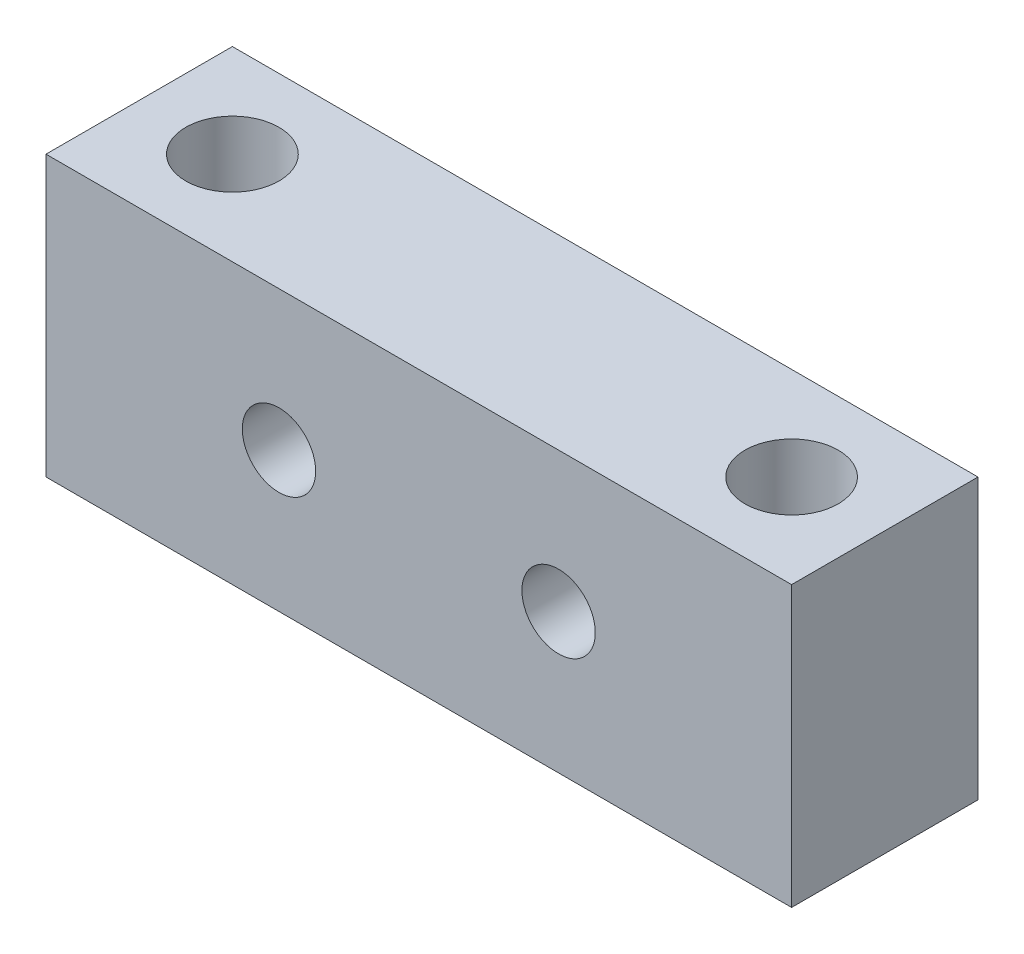
ISO-10303-21;
HEADER;
FILE_DESCRIPTION(('STEP AP214'),'2;1');
FILE_NAME('part.step','',(''),(''),'','','');
FILE_SCHEMA(('AUTOMOTIVE_DESIGN { 1 0 10303 214 1 1 1 1 }'));
ENDSEC;
DATA;
#1=APPLICATION_CONTEXT('core data for automotive mechanical design processes');
#2=APPLICATION_PROTOCOL_DEFINITION('international standard','automotive_design',2000,#1);
#3=PRODUCT_CONTEXT('',#1,'mechanical');
#4=PRODUCT('Part','Part','',(#3));
#5=PRODUCT_RELATED_PRODUCT_CATEGORY('part','',(#4));
#6=PRODUCT_DEFINITION_FORMATION('','',#4);
#7=PRODUCT_DEFINITION_CONTEXT('part definition',#1,'design');
#8=PRODUCT_DEFINITION('design','',#6,#7);
#9=PRODUCT_DEFINITION_SHAPE('','',#8);
#10=(LENGTH_UNIT() NAMED_UNIT(*) SI_UNIT(.MILLI.,.METRE.));
#11=(NAMED_UNIT(*) PLANE_ANGLE_UNIT() SI_UNIT($,.RADIAN.));
#12=(NAMED_UNIT(*) SI_UNIT($,.STERADIAN.) SOLID_ANGLE_UNIT());
#13=UNCERTAINTY_MEASURE_WITH_UNIT(LENGTH_MEASURE(1.E-05),#10,'distance_accuracy_value','');
#14=(GEOMETRIC_REPRESENTATION_CONTEXT(3) GLOBAL_UNCERTAINTY_ASSIGNED_CONTEXT((#13)) GLOBAL_UNIT_ASSIGNED_CONTEXT((#10,
#11,#12)) REPRESENTATION_CONTEXT('',''));
#15=CARTESIAN_POINT('',(0.,0.,0.));
#16=DIRECTION('',(0.,0.,1.));
#17=DIRECTION('',(1.,0.,0.));
#18=AXIS2_PLACEMENT_3D('',#15,#16,#17);
#19=CARTESIAN_POINT('',(25.4,9.525,12.7));
#20=DIRECTION('',(-1.,0.,0.));
#21=DIRECTION('',(0.,-1.,0.));
#22=AXIS2_PLACEMENT_3D('',#19,#20,#21);
#23=PLANE('',#22);
#24=DIRECTION('',(0.,1.,0.));
#25=VECTOR('',#24,1.);
#26=CARTESIAN_POINT('',(25.4,9.525,0.));
#27=LINE('',#26,#25);
#28=CARTESIAN_POINT('',(25.4,-9.525,0.));
#29=VERTEX_POINT('',#28);
#30=CARTESIAN_POINT('',(25.4,9.525,0.));
#31=VERTEX_POINT('',#30);
#32=EDGE_CURVE('E102',#29,#31,#27,.T.);
#33=ORIENTED_EDGE('',*,*,#32,.T.);
#34=DIRECTION('',(0.,0.,-1.));
#35=VECTOR('',#34,1.);
#36=CARTESIAN_POINT('',(25.4,9.525,12.7));
#37=LINE('',#36,#35);
#38=CARTESIAN_POINT('',(25.4,9.525,12.7));
#39=VERTEX_POINT('',#38);
#40=EDGE_CURVE('E11',#39,#31,#37,.T.);
#41=ORIENTED_EDGE('',*,*,#40,.F.);
#42=DIRECTION('',(0.,1.,0.));
#43=VECTOR('',#42,1.);
#44=CARTESIAN_POINT('',(25.4,9.525,12.7));
#45=LINE('',#44,#43);
#46=CARTESIAN_POINT('',(25.4,-9.525,12.7));
#47=VERTEX_POINT('',#46);
#48=EDGE_CURVE('E90',#47,#39,#45,.T.);
#49=ORIENTED_EDGE('',*,*,#48,.F.);
#50=DIRECTION('',(0.,0.,-1.));
#51=VECTOR('',#50,1.);
#52=CARTESIAN_POINT('',(25.4,-9.525,12.7));
#53=LINE('',#52,#51);
#54=EDGE_CURVE('E98',#47,#29,#53,.T.);
#55=ORIENTED_EDGE('',*,*,#54,.T.);
#56=EDGE_LOOP('',(#33,#41,#49,#55));
#57=FACE_BOUND('',#56,.T.);
#58=ADVANCED_FACE('F39',(#57),#23,.F.);
#59=CARTESIAN_POINT('',(-25.4,9.525,12.7));
#60=DIRECTION('',(0.,-1.,0.));
#61=DIRECTION('',(0.,0.,-1.));
#62=AXIS2_PLACEMENT_3D('',#59,#60,#61);
#63=PLANE('',#62);
#64=CARTESIAN_POINT('',(-19.05,9.525,6.35));
#65=DIRECTION('',(0.,1.,0.));
#66=DIRECTION('',(0.,0.,1.));
#67=AXIS2_PLACEMENT_3D('',#64,#65,#66);
#68=CIRCLE('',#67,3.175);
#69=CARTESIAN_POINT('',(-19.05,9.525,9.525));
#70=VERTEX_POINT('',#69);
#71=EDGE_CURVE('E134',#70,#70,#68,.T.);
#72=ORIENTED_EDGE('',*,*,#71,.F.);
#73=EDGE_LOOP('',(#72));
#74=FACE_BOUND('',#73,.T.);
#75=CARTESIAN_POINT('',(19.05,9.525,6.35));
#76=DIRECTION('',(0.,1.,0.));
#77=DIRECTION('',(0.,0.,-1.));
#78=AXIS2_PLACEMENT_3D('',#75,#76,#77);
#79=CIRCLE('',#78,3.175);
#80=CARTESIAN_POINT('',(19.05,9.525,9.525));
#81=VERTEX_POINT('',#80);
#82=EDGE_CURVE('E131',#81,#81,#79,.T.);
#83=ORIENTED_EDGE('',*,*,#82,.F.);
#84=EDGE_LOOP('',(#83));
#85=FACE_BOUND('',#84,.T.);
#86=DIRECTION('',(-1.,0.,0.));
#87=VECTOR('',#86,1.);
#88=CARTESIAN_POINT('',(-25.4,9.525,0.));
#89=LINE('',#88,#87);
#90=CARTESIAN_POINT('',(-25.4,9.525,0.));
#91=VERTEX_POINT('',#90);
#92=EDGE_CURVE('E94',#31,#91,#89,.T.);
#93=ORIENTED_EDGE('',*,*,#92,.T.);
#94=DIRECTION('',(0.,0.,-1.));
#95=VECTOR('',#94,1.);
#96=CARTESIAN_POINT('',(-25.4,9.525,12.7));
#97=LINE('',#96,#95);
#98=CARTESIAN_POINT('',(-25.4,9.525,12.7));
#99=VERTEX_POINT('',#98);
#100=EDGE_CURVE('E47',#99,#91,#97,.T.);
#101=ORIENTED_EDGE('',*,*,#100,.F.);
#102=DIRECTION('',(-1.,0.,0.));
#103=VECTOR('',#102,1.);
#104=CARTESIAN_POINT('',(-25.4,9.525,12.7));
#105=LINE('',#104,#103);
#106=EDGE_CURVE('E85',#39,#99,#105,.T.);
#107=ORIENTED_EDGE('',*,*,#106,.F.);
#108=ORIENTED_EDGE('',*,*,#40,.T.);
#109=EDGE_LOOP('',(#93,#101,#107,#108));
#110=FACE_BOUND('',#109,.T.);
#111=ADVANCED_FACE('F93',(#74,#85,#110),#63,.F.);
#112=CARTESIAN_POINT('',(-25.4,9.525,12.7));
#113=DIRECTION('',(1.,0.,0.));
#114=DIRECTION('',(0.,1.,0.));
#115=AXIS2_PLACEMENT_3D('',#112,#113,#114);
#116=PLANE('',#115);
#117=DIRECTION('',(0.,-1.,0.));
#118=VECTOR('',#117,1.);
#119=CARTESIAN_POINT('',(-25.4,9.525,0.));
#120=LINE('',#119,#118);
#121=CARTESIAN_POINT('',(-25.4,-9.525,0.));
#122=VERTEX_POINT('',#121);
#123=EDGE_CURVE('E72',#91,#122,#120,.T.);
#124=ORIENTED_EDGE('',*,*,#123,.T.);
#125=DIRECTION('',(0.,0.,-1.));
#126=VECTOR('',#125,1.);
#127=CARTESIAN_POINT('',(-25.4,-9.525,12.7));
#128=LINE('',#127,#126);
#129=CARTESIAN_POINT('',(-25.4,-9.525,12.7));
#130=VERTEX_POINT('',#129);
#131=EDGE_CURVE('E95',#130,#122,#128,.T.);
#132=ORIENTED_EDGE('',*,*,#131,.F.);
#133=DIRECTION('',(0.,-1.,0.));
#134=VECTOR('',#133,1.);
#135=CARTESIAN_POINT('',(-25.4,9.525,12.7));
#136=LINE('',#135,#134);
#137=EDGE_CURVE('E88',#99,#130,#136,.T.);
#138=ORIENTED_EDGE('',*,*,#137,.F.);
#139=ORIENTED_EDGE('',*,*,#100,.T.);
#140=EDGE_LOOP('',(#124,#132,#138,#139));
#141=FACE_BOUND('',#140,.T.);
#142=ADVANCED_FACE('F96',(#141),#116,.F.);
#143=CARTESIAN_POINT('',(-25.4,-9.525,12.7));
#144=DIRECTION('',(0.,1.,0.));
#145=DIRECTION('',(0.,0.,1.));
#146=AXIS2_PLACEMENT_3D('',#143,#144,#145);
#147=PLANE('',#146);
#148=CARTESIAN_POINT('',(-19.05,-9.525,6.35));
#149=DIRECTION('',(0.,1.,0.));
#150=DIRECTION('',(0.,0.,1.));
#151=AXIS2_PLACEMENT_3D('',#148,#149,#150);
#152=CIRCLE('',#151,3.175);
#153=CARTESIAN_POINT('',(-19.05,-9.525,9.525));
#154=VERTEX_POINT('',#153);
#155=EDGE_CURVE('E120',#154,#154,#152,.T.);
#156=ORIENTED_EDGE('',*,*,#155,.T.);
#157=EDGE_LOOP('',(#156));
#158=FACE_BOUND('',#157,.T.);
#159=CARTESIAN_POINT('',(19.05,-9.525,6.35));
#160=DIRECTION('',(0.,1.,0.));
#161=DIRECTION('',(0.,0.,-1.));
#162=AXIS2_PLACEMENT_3D('',#159,#160,#161);
#163=CIRCLE('',#162,3.175);
#164=CARTESIAN_POINT('',(19.05,-9.525,9.525));
#165=VERTEX_POINT('',#164);
#166=EDGE_CURVE('E128',#165,#165,#163,.T.);
#167=ORIENTED_EDGE('',*,*,#166,.T.);
#168=EDGE_LOOP('',(#167));
#169=FACE_BOUND('',#168,.T.);
#170=DIRECTION('',(1.,0.,0.));
#171=VECTOR('',#170,1.);
#172=CARTESIAN_POINT('',(-25.4,-9.525,0.));
#173=LINE('',#172,#171);
#174=EDGE_CURVE('E78',#122,#29,#173,.T.);
#175=ORIENTED_EDGE('',*,*,#174,.T.);
#176=ORIENTED_EDGE('',*,*,#54,.F.);
#177=DIRECTION('',(1.,0.,0.));
#178=VECTOR('',#177,1.);
#179=CARTESIAN_POINT('',(-25.4,-9.525,12.7));
#180=LINE('',#179,#178);
#181=EDGE_CURVE('E55',#130,#47,#180,.T.);
#182=ORIENTED_EDGE('',*,*,#181,.F.);
#183=ORIENTED_EDGE('',*,*,#131,.T.);
#184=EDGE_LOOP('',(#175,#176,#182,#183));
#185=FACE_BOUND('',#184,.T.);
#186=ADVANCED_FACE('F110',(#158,#169,#185),#147,.F.);
#187=CARTESIAN_POINT('',(0.,0.,12.7));
#188=DIRECTION('',(0.,0.,1.));
#189=DIRECTION('',(1.,0.,0.));
#190=AXIS2_PLACEMENT_3D('',#187,#188,#189);
#191=PLANE('',#190);
#192=CARTESIAN_POINT('',(-9.525,0.,12.7));
#193=DIRECTION('',(0.,0.,1.));
#194=DIRECTION('',(1.,0.,0.));
#195=AXIS2_PLACEMENT_3D('',#192,#193,#194);
#196=CIRCLE('',#195,2.5);
#197=CARTESIAN_POINT('',(-7.025,0.,12.7));
#198=VERTEX_POINT('',#197);
#199=EDGE_CURVE('E123',#198,#198,#196,.T.);
#200=ORIENTED_EDGE('',*,*,#199,.F.);
#201=EDGE_LOOP('',(#200));
#202=FACE_BOUND('',#201,.T.);
#203=CARTESIAN_POINT('',(9.525,0.,12.7));
#204=DIRECTION('',(0.,0.,1.));
#205=DIRECTION('',(-1.,0.,0.));
#206=AXIS2_PLACEMENT_3D('',#203,#204,#205);
#207=CIRCLE('',#206,2.5);
#208=CARTESIAN_POINT('',(7.025,0.,12.7));
#209=VERTEX_POINT('',#208);
#210=EDGE_CURVE('E119',#209,#209,#207,.T.);
#211=ORIENTED_EDGE('',*,*,#210,.F.);
#212=EDGE_LOOP('',(#211));
#213=FACE_BOUND('',#212,.T.);
#214=ORIENTED_EDGE('',*,*,#48,.T.);
#215=ORIENTED_EDGE('',*,*,#106,.T.);
#216=ORIENTED_EDGE('',*,*,#137,.T.);
#217=ORIENTED_EDGE('',*,*,#181,.T.);
#218=EDGE_LOOP('',(#214,#215,#216,#217));
#219=FACE_BOUND('',#218,.T.);
#220=ADVANCED_FACE('F86',(#202,#213,#219),#191,.T.);
#221=CARTESIAN_POINT('',(0.,0.,0.));
#222=DIRECTION('',(0.,0.,1.));
#223=DIRECTION('',(1.,0.,0.));
#224=AXIS2_PLACEMENT_3D('',#221,#222,#223);
#225=PLANE('',#224);
#226=CARTESIAN_POINT('',(-9.525,0.,0.));
#227=DIRECTION('',(0.,0.,1.));
#228=DIRECTION('',(1.,0.,0.));
#229=AXIS2_PLACEMENT_3D('',#226,#227,#228);
#230=CIRCLE('',#229,2.5);
#231=CARTESIAN_POINT('',(-7.025,0.,0.));
#232=VERTEX_POINT('',#231);
#233=EDGE_CURVE('E105',#232,#232,#230,.T.);
#234=ORIENTED_EDGE('',*,*,#233,.T.);
#235=EDGE_LOOP('',(#234));
#236=FACE_BOUND('',#235,.T.);
#237=CARTESIAN_POINT('',(9.525,0.,0.));
#238=DIRECTION('',(0.,0.,1.));
#239=DIRECTION('',(-1.,0.,0.));
#240=AXIS2_PLACEMENT_3D('',#237,#238,#239);
#241=CIRCLE('',#240,2.5);
#242=CARTESIAN_POINT('',(7.025,0.,0.));
#243=VERTEX_POINT('',#242);
#244=EDGE_CURVE('E116',#243,#243,#241,.T.);
#245=ORIENTED_EDGE('',*,*,#244,.T.);
#246=EDGE_LOOP('',(#245));
#247=FACE_BOUND('',#246,.T.);
#248=ORIENTED_EDGE('',*,*,#32,.F.);
#249=ORIENTED_EDGE('',*,*,#174,.F.);
#250=ORIENTED_EDGE('',*,*,#123,.F.);
#251=ORIENTED_EDGE('',*,*,#92,.F.);
#252=EDGE_LOOP('',(#248,#249,#250,#251));
#253=FACE_BOUND('',#252,.T.);
#254=ADVANCED_FACE('F113',(#236,#247,#253),#225,.F.);
#255=CARTESIAN_POINT('',(9.525,0.,0.));
#256=DIRECTION('',(0.,0.,1.));
#257=DIRECTION('',(1.,0.,0.));
#258=AXIS2_PLACEMENT_3D('',#255,#256,#257);
#259=CYLINDRICAL_SURFACE('',#258,2.5);
#260=ORIENTED_EDGE('',*,*,#244,.F.);
#261=EDGE_LOOP('',(#260));
#262=FACE_BOUND('',#261,.T.);
#263=ORIENTED_EDGE('',*,*,#210,.T.);
#264=EDGE_LOOP('',(#263));
#265=FACE_BOUND('',#264,.T.);
#266=ADVANCED_FACE('F161',(#262,#265),#259,.F.);
#267=CARTESIAN_POINT('',(-9.525,0.,0.));
#268=DIRECTION('',(0.,0.,1.));
#269=DIRECTION('',(1.,0.,0.));
#270=AXIS2_PLACEMENT_3D('',#267,#268,#269);
#271=CYLINDRICAL_SURFACE('',#270,2.5);
#272=ORIENTED_EDGE('',*,*,#233,.F.);
#273=EDGE_LOOP('',(#272));
#274=FACE_BOUND('',#273,.T.);
#275=ORIENTED_EDGE('',*,*,#199,.T.);
#276=EDGE_LOOP('',(#275));
#277=FACE_BOUND('',#276,.T.);
#278=ADVANCED_FACE('F154',(#274,#277),#271,.F.);
#279=CARTESIAN_POINT('',(19.05,-9.525,6.35));
#280=DIRECTION('',(0.,1.,0.));
#281=DIRECTION('',(0.,0.,1.));
#282=AXIS2_PLACEMENT_3D('',#279,#280,#281);
#283=CYLINDRICAL_SURFACE('',#282,3.175);
#284=CARTESIAN_POINT('',(19.05,-9.525,9.525));
#285=CARTESIAN_POINT('',(19.05,-9.3265625,9.525));
#286=CARTESIAN_POINT('',(19.05,-9.128125,9.525));
#287=CARTESIAN_POINT('',(19.05,-8.73125,9.525));
#288=CARTESIAN_POINT('',(19.05,-8.5328125,9.525));
#289=CARTESIAN_POINT('',(19.05,-8.1359375,9.525));
#290=CARTESIAN_POINT('',(19.05,-7.9375,9.525));
#291=CARTESIAN_POINT('',(19.05,-7.540625,9.525));
#292=CARTESIAN_POINT('',(19.05,-7.3421875,9.525));
#293=CARTESIAN_POINT('',(19.05,-6.9453125,9.525));
#294=CARTESIAN_POINT('',(19.05,-6.746875,9.525));
#295=CARTESIAN_POINT('',(19.05,-6.35,9.525));
#296=CARTESIAN_POINT('',(19.05,-6.1515625,9.525));
#297=CARTESIAN_POINT('',(19.05,-5.7546875,9.525));
#298=CARTESIAN_POINT('',(19.05,-5.55625,9.525));
#299=CARTESIAN_POINT('',(19.05,-5.159375,9.525));
#300=CARTESIAN_POINT('',(19.05,-4.9609375,9.525));
#301=CARTESIAN_POINT('',(19.05,-4.5640625,9.525));
#302=CARTESIAN_POINT('',(19.05,-4.365625,9.525));
#303=CARTESIAN_POINT('',(19.05,-3.96875,9.525));
#304=CARTESIAN_POINT('',(19.05,-3.7703125,9.525));
#305=CARTESIAN_POINT('',(19.05,-3.3734375,9.525));
#306=CARTESIAN_POINT('',(19.05,-3.175,9.525));
#307=CARTESIAN_POINT('',(19.05,-2.778125,9.525));
#308=CARTESIAN_POINT('',(19.05,-2.5796875,9.525));
#309=CARTESIAN_POINT('',(19.05,-2.1828125,9.525));
#310=CARTESIAN_POINT('',(19.05,-1.984375,9.525));
#311=CARTESIAN_POINT('',(19.05,-1.5875,9.525));
#312=CARTESIAN_POINT('',(19.05,-1.3890625,9.525));
#313=CARTESIAN_POINT('',(19.05,-0.992187500000002,9.525));
#314=CARTESIAN_POINT('',(19.05,-0.793750000000002,9.525));
#315=CARTESIAN_POINT('',(19.05,-0.396875000000002,9.525));
#316=CARTESIAN_POINT('',(19.05,-0.198437500000002,9.525));
#317=CARTESIAN_POINT('',(19.05,0.198437499999998,9.525));
#318=CARTESIAN_POINT('',(19.05,0.396874999999998,9.525));
#319=CARTESIAN_POINT('',(19.05,0.793749999999999,9.525));
#320=CARTESIAN_POINT('',(19.05,0.992187499999999,9.525));
#321=CARTESIAN_POINT('',(19.05,1.3890625,9.525));
#322=CARTESIAN_POINT('',(19.05,1.5875,9.525));
#323=CARTESIAN_POINT('',(19.05,1.984375,9.525));
#324=CARTESIAN_POINT('',(19.05,2.1828125,9.525));
#325=CARTESIAN_POINT('',(19.05,2.5796875,9.525));
#326=CARTESIAN_POINT('',(19.05,2.778125,9.525));
#327=CARTESIAN_POINT('',(19.05,3.175,9.525));
#328=CARTESIAN_POINT('',(19.05,3.3734375,9.525));
#329=CARTESIAN_POINT('',(19.05,3.7703125,9.525));
#330=CARTESIAN_POINT('',(19.05,3.96875,9.525));
#331=CARTESIAN_POINT('',(19.05,4.365625,9.525));
#332=CARTESIAN_POINT('',(19.05,4.5640625,9.525));
#333=CARTESIAN_POINT('',(19.05,4.9609375,9.525));
#334=CARTESIAN_POINT('',(19.05,5.159375,9.525));
#335=CARTESIAN_POINT('',(19.05,5.55625,9.525));
#336=CARTESIAN_POINT('',(19.05,5.7546875,9.525));
#337=CARTESIAN_POINT('',(19.05,6.1515625,9.525));
#338=CARTESIAN_POINT('',(19.05,6.35,9.525));
#339=CARTESIAN_POINT('',(19.05,6.746875,9.525));
#340=CARTESIAN_POINT('',(19.05,6.9453125,9.525));
#341=CARTESIAN_POINT('',(19.05,7.3421875,9.525));
#342=CARTESIAN_POINT('',(19.05,7.540625,9.525));
#343=CARTESIAN_POINT('',(19.05,7.9375,9.525));
#344=CARTESIAN_POINT('',(19.05,8.1359375,9.525));
#345=CARTESIAN_POINT('',(19.05,8.5328125,9.525));
#346=CARTESIAN_POINT('',(19.05,8.73125,9.525));
#347=CARTESIAN_POINT('',(19.05,9.128125,9.525));
#348=CARTESIAN_POINT('',(19.05,9.3265625,9.525));
#349=CARTESIAN_POINT('',(19.05,9.525,9.525));
#350=B_SPLINE_CURVE_WITH_KNOTS('',3,(#284,#285,#286,#287,#288,#289,#290,#291,#292,#293,#294,
#295,#296,#297,#298,#299,#300,#301,#302,#303,#304,#305,#306,#307,#308,#309,#310,#311,#312,#313,
#314,#315,#316,#317,#318,#319,#320,#321,#322,#323,#324,#325,#326,#327,#328,#329,#330,#331,#332,
#333,#334,#335,#336,#337,#338,#339,#340,#341,#342,#343,#344,#345,#346,#347,#348,#349),
.UNSPECIFIED.,.F.,.F.,(4,2,2,2,2,2,2,2,2,2,2,2,2,2,2,2,2,2,2,2,2,2,2,2,2,2,2,2,2,2,2,2,4),(0.,
0.5953125,1.190625,1.7859375,2.38125,2.9765625,3.571875,4.1671875,4.7625,5.3578125,5.953125,
6.5484375,7.14375,7.7390625,8.334375,8.9296875,9.525,10.1203125,10.715625,11.3109375,11.90625,
12.5015625,13.096875,13.6921875,14.2875,14.8828125,15.478125,16.0734375,16.66875,17.2640625,
17.859375,18.4546875,19.05),.UNSPECIFIED.);
#351=EDGE_CURVE('BSEAM145',#165,#81,#350,.T.);
#352=ORIENTED_EDGE('',*,*,#166,.F.);
#353=ORIENTED_EDGE('',*,*,#82,.T.);
#354=ORIENTED_EDGE('',*,*,#351,.T.);
#355=ORIENTED_EDGE('',*,*,#351,.F.);
#356=EDGE_LOOP('',(#352,#354,#353,#355));
#357=FACE_BOUND('',#356,.T.);
#358=ADVANCED_FACE('F145',(#357),#283,.F.);
#359=CARTESIAN_POINT('',(-19.05,-9.525,6.35));
#360=DIRECTION('',(0.,1.,0.));
#361=DIRECTION('',(0.,0.,1.));
#362=AXIS2_PLACEMENT_3D('',#359,#360,#361);
#363=CYLINDRICAL_SURFACE('',#362,3.175);
#364=CARTESIAN_POINT('',(-19.05,-9.525,9.525));
#365=CARTESIAN_POINT('',(-19.05,-9.3265625,9.525));
#366=CARTESIAN_POINT('',(-19.05,-9.128125,9.525));
#367=CARTESIAN_POINT('',(-19.05,-8.73125,9.525));
#368=CARTESIAN_POINT('',(-19.05,-8.5328125,9.525));
#369=CARTESIAN_POINT('',(-19.05,-8.1359375,9.525));
#370=CARTESIAN_POINT('',(-19.05,-7.9375,9.525));
#371=CARTESIAN_POINT('',(-19.05,-7.540625,9.525));
#372=CARTESIAN_POINT('',(-19.05,-7.3421875,9.525));
#373=CARTESIAN_POINT('',(-19.05,-6.9453125,9.525));
#374=CARTESIAN_POINT('',(-19.05,-6.746875,9.525));
#375=CARTESIAN_POINT('',(-19.05,-6.35,9.525));
#376=CARTESIAN_POINT('',(-19.05,-6.1515625,9.525));
#377=CARTESIAN_POINT('',(-19.05,-5.7546875,9.525));
#378=CARTESIAN_POINT('',(-19.05,-5.55625,9.525));
#379=CARTESIAN_POINT('',(-19.05,-5.159375,9.525));
#380=CARTESIAN_POINT('',(-19.05,-4.9609375,9.525));
#381=CARTESIAN_POINT('',(-19.05,-4.5640625,9.525));
#382=CARTESIAN_POINT('',(-19.05,-4.365625,9.525));
#383=CARTESIAN_POINT('',(-19.05,-3.96875,9.525));
#384=CARTESIAN_POINT('',(-19.05,-3.7703125,9.525));
#385=CARTESIAN_POINT('',(-19.05,-3.3734375,9.525));
#386=CARTESIAN_POINT('',(-19.05,-3.175,9.525));
#387=CARTESIAN_POINT('',(-19.05,-2.778125,9.525));
#388=CARTESIAN_POINT('',(-19.05,-2.5796875,9.525));
#389=CARTESIAN_POINT('',(-19.05,-2.1828125,9.525));
#390=CARTESIAN_POINT('',(-19.05,-1.984375,9.525));
#391=CARTESIAN_POINT('',(-19.05,-1.5875,9.525));
#392=CARTESIAN_POINT('',(-19.05,-1.3890625,9.525));
#393=CARTESIAN_POINT('',(-19.05,-0.992187500000002,9.525));
#394=CARTESIAN_POINT('',(-19.05,-0.793750000000002,9.525));
#395=CARTESIAN_POINT('',(-19.05,-0.396875000000002,9.525));
#396=CARTESIAN_POINT('',(-19.05,-0.198437500000002,9.525));
#397=CARTESIAN_POINT('',(-19.05,0.198437499999998,9.525));
#398=CARTESIAN_POINT('',(-19.05,0.396874999999998,9.525));
#399=CARTESIAN_POINT('',(-19.05,0.793749999999999,9.525));
#400=CARTESIAN_POINT('',(-19.05,0.992187499999999,9.525));
#401=CARTESIAN_POINT('',(-19.05,1.3890625,9.525));
#402=CARTESIAN_POINT('',(-19.05,1.5875,9.525));
#403=CARTESIAN_POINT('',(-19.05,1.984375,9.525));
#404=CARTESIAN_POINT('',(-19.05,2.1828125,9.525));
#405=CARTESIAN_POINT('',(-19.05,2.5796875,9.525));
#406=CARTESIAN_POINT('',(-19.05,2.778125,9.525));
#407=CARTESIAN_POINT('',(-19.05,3.175,9.525));
#408=CARTESIAN_POINT('',(-19.05,3.3734375,9.525));
#409=CARTESIAN_POINT('',(-19.05,3.7703125,9.525));
#410=CARTESIAN_POINT('',(-19.05,3.96875,9.525));
#411=CARTESIAN_POINT('',(-19.05,4.365625,9.525));
#412=CARTESIAN_POINT('',(-19.05,4.5640625,9.525));
#413=CARTESIAN_POINT('',(-19.05,4.9609375,9.525));
#414=CARTESIAN_POINT('',(-19.05,5.159375,9.525));
#415=CARTESIAN_POINT('',(-19.05,5.55625,9.525));
#416=CARTESIAN_POINT('',(-19.05,5.7546875,9.525));
#417=CARTESIAN_POINT('',(-19.05,6.1515625,9.525));
#418=CARTESIAN_POINT('',(-19.05,6.35,9.525));
#419=CARTESIAN_POINT('',(-19.05,6.746875,9.525));
#420=CARTESIAN_POINT('',(-19.05,6.9453125,9.525));
#421=CARTESIAN_POINT('',(-19.05,7.3421875,9.525));
#422=CARTESIAN_POINT('',(-19.05,7.540625,9.525));
#423=CARTESIAN_POINT('',(-19.05,7.9375,9.525));
#424=CARTESIAN_POINT('',(-19.05,8.1359375,9.525));
#425=CARTESIAN_POINT('',(-19.05,8.5328125,9.525));
#426=CARTESIAN_POINT('',(-19.05,8.73125,9.525));
#427=CARTESIAN_POINT('',(-19.05,9.128125,9.525));
#428=CARTESIAN_POINT('',(-19.05,9.3265625,9.525));
#429=CARTESIAN_POINT('',(-19.05,9.525,9.525));
#430=B_SPLINE_CURVE_WITH_KNOTS('',3,(#364,#365,#366,#367,#368,#369,#370,#371,#372,#373,#374,
#375,#376,#377,#378,#379,#380,#381,#382,#383,#384,#385,#386,#387,#388,#389,#390,#391,#392,#393,
#394,#395,#396,#397,#398,#399,#400,#401,#402,#403,#404,#405,#406,#407,#408,#409,#410,#411,#412,
#413,#414,#415,#416,#417,#418,#419,#420,#421,#422,#423,#424,#425,#426,#427,#428,#429),
.UNSPECIFIED.,.F.,.F.,(4,2,2,2,2,2,2,2,2,2,2,2,2,2,2,2,2,2,2,2,2,2,2,2,2,2,2,2,2,2,2,2,4),(0.,
0.5953125,1.190625,1.7859375,2.38125,2.9765625,3.571875,4.1671875,4.7625,5.3578125,5.953125,
6.5484375,7.14375,7.7390625,8.334375,8.9296875,9.525,10.1203125,10.715625,11.3109375,11.90625,
12.5015625,13.096875,13.6921875,14.2875,14.8828125,15.478125,16.0734375,16.66875,17.2640625,
17.859375,18.4546875,19.05),.UNSPECIFIED.);
#431=EDGE_CURVE('BSEAM142',#154,#70,#430,.T.);
#432=ORIENTED_EDGE('',*,*,#155,.F.);
#433=ORIENTED_EDGE('',*,*,#71,.T.);
#434=ORIENTED_EDGE('',*,*,#431,.T.);
#435=ORIENTED_EDGE('',*,*,#431,.F.);
#436=EDGE_LOOP('',(#432,#434,#433,#435));
#437=FACE_BOUND('',#436,.T.);
#438=ADVANCED_FACE('F142',(#437),#363,.F.);
#439=CLOSED_SHELL('',(#58,#111,#142,#186,#220,#254,#266,#278,#358,#438));
#440=MANIFOLD_SOLID_BREP('B2',#439);
#441=ADVANCED_BREP_SHAPE_REPRESENTATION('',(#18,#440),#14);
#442=SHAPE_DEFINITION_REPRESENTATION(#9,#441);
ENDSEC;
END-ISO-10303-21;
